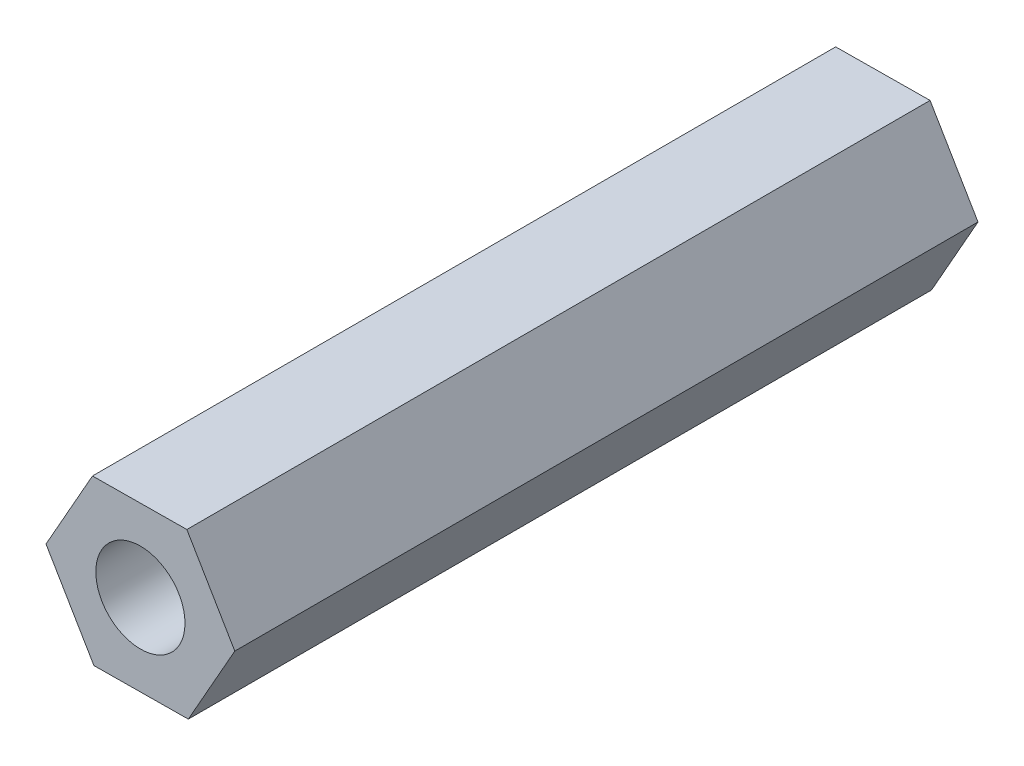
ISO-10303-21;
HEADER;
FILE_DESCRIPTION(('STEP AP214'),'2;1');
FILE_NAME('part.step','',(''),(''),'','','');
FILE_SCHEMA(('AUTOMOTIVE_DESIGN { 1 0 10303 214 1 1 1 1 }'));
ENDSEC;
DATA;
#1=APPLICATION_CONTEXT('core data for automotive mechanical design processes');
#2=APPLICATION_PROTOCOL_DEFINITION('international standard','automotive_design',2000,#1);
#3=PRODUCT_CONTEXT('',#1,'mechanical');
#4=PRODUCT('Part','Part','',(#3));
#5=PRODUCT_RELATED_PRODUCT_CATEGORY('part','',(#4));
#6=PRODUCT_DEFINITION_FORMATION('','',#4);
#7=PRODUCT_DEFINITION_CONTEXT('part definition',#1,'design');
#8=PRODUCT_DEFINITION('design','',#6,#7);
#9=PRODUCT_DEFINITION_SHAPE('','',#8);
#10=(LENGTH_UNIT() NAMED_UNIT(*) SI_UNIT(.MILLI.,.METRE.));
#11=(NAMED_UNIT(*) PLANE_ANGLE_UNIT() SI_UNIT($,.RADIAN.));
#12=(NAMED_UNIT(*) SI_UNIT($,.STERADIAN.) SOLID_ANGLE_UNIT());
#13=UNCERTAINTY_MEASURE_WITH_UNIT(LENGTH_MEASURE(1.E-05),#10,'distance_accuracy_value','');
#14=(GEOMETRIC_REPRESENTATION_CONTEXT(3) GLOBAL_UNCERTAINTY_ASSIGNED_CONTEXT((#13)) GLOBAL_UNIT_ASSIGNED_CONTEXT((#10,
#11,#12)) REPRESENTATION_CONTEXT('',''));
#15=CARTESIAN_POINT('',(0.,0.,0.));
#16=DIRECTION('',(0.,0.,1.));
#17=DIRECTION('',(1.,0.,0.));
#18=AXIS2_PLACEMENT_3D('',#15,#16,#17);
#19=CARTESIAN_POINT('',(0.,0.,25.));
#20=DIRECTION('',(0.,0.,1.));
#21=DIRECTION('',(1.,0.,0.));
#22=AXIS2_PLACEMENT_3D('',#19,#20,#21);
#23=PLANE('',#22);
#24=DIRECTION('',(0.999961257640527,0.00880245522430783,0.));
#25=VECTOR('',#24,1.);
#26=CARTESIAN_POINT('',(-1.56344497664753,-2.76386923321798,25.));
#27=LINE('',#26,#25);
#28=CARTESIAN_POINT('',(-1.56344497664753,-2.76386923321798,25.));
#29=VERTEX_POINT('',#28);
#30=CARTESIAN_POINT('',(1.61185848038122,-2.73591768380492,25.));
#31=VERTEX_POINT('',#30);
#32=EDGE_CURVE('E131',#29,#31,#27,.T.);
#33=ORIENTED_EDGE('',*,*,#32,.T.);
#34=DIRECTION('',(0.492357478980338,0.870393079529086,0.));
#35=VECTOR('',#34,1.);
#36=CARTESIAN_POINT('',(1.61185848038122,-2.73591768380492,25.));
#37=LINE('',#36,#35);
#38=CARTESIAN_POINT('',(3.17530345702875,0.0279515494130611,25.));
#39=VERTEX_POINT('',#38);
#40=EDGE_CURVE('E89',#31,#39,#37,.T.);
#41=ORIENTED_EDGE('',*,*,#40,.T.);
#42=DIRECTION('',(-0.507603778660189,0.861590624304778,0.));
#43=VECTOR('',#42,1.);
#44=CARTESIAN_POINT('',(3.17530345702875,0.0279515494130611,25.));
#45=LINE('',#44,#43);
#46=CARTESIAN_POINT('',(1.56344497664753,2.76386923321798,25.));
#47=VERTEX_POINT('',#46);
#48=EDGE_CURVE('E102',#39,#47,#45,.T.);
#49=ORIENTED_EDGE('',*,*,#48,.T.);
#50=DIRECTION('',(-0.999961257640527,-0.00880245522430783,0.));
#51=VECTOR('',#50,1.);
#52=CARTESIAN_POINT('',(1.56344497664753,2.76386923321798,25.));
#53=LINE('',#52,#51);
#54=CARTESIAN_POINT('',(-1.61185848038122,2.73591768380492,25.));
#55=VERTEX_POINT('',#54);
#56=EDGE_CURVE('E96',#47,#55,#53,.T.);
#57=ORIENTED_EDGE('',*,*,#56,.T.);
#58=DIRECTION('',(-0.492357478980338,-0.870393079529086,0.));
#59=VECTOR('',#58,1.);
#60=CARTESIAN_POINT('',(-1.61185848038122,2.73591768380492,25.));
#61=LINE('',#60,#59);
#62=CARTESIAN_POINT('',(-3.17530345702875,-0.02795154941306,25.));
#63=VERTEX_POINT('',#62);
#64=EDGE_CURVE('E100',#55,#63,#61,.T.);
#65=ORIENTED_EDGE('',*,*,#64,.T.);
#66=DIRECTION('',(0.507603778660189,-0.861590624304779,0.));
#67=VECTOR('',#66,1.);
#68=CARTESIAN_POINT('',(-3.17530345702875,-0.02795154941306,25.));
#69=LINE('',#68,#67);
#70=EDGE_CURVE('E52',#63,#29,#69,.T.);
#71=ORIENTED_EDGE('',*,*,#70,.T.);
#72=EDGE_LOOP('',(#33,#41,#49,#57,#65,#71));
#73=FACE_BOUND('',#72,.T.);
#74=CARTESIAN_POINT('',(0.,0.,25.));
#75=DIRECTION('',(0.,0.,1.));
#76=DIRECTION('',(1.,0.,0.));
#77=AXIS2_PLACEMENT_3D('',#74,#75,#76);
#78=CIRCLE('',#77,1.5);
#79=CARTESIAN_POINT('',(1.5,0.,25.));
#80=VERTEX_POINT('',#79);
#81=EDGE_CURVE('E124',#80,#80,#78,.T.);
#82=ORIENTED_EDGE('',*,*,#81,.F.);
#83=EDGE_LOOP('',(#82));
#84=FACE_BOUND('',#83,.T.);
#85=ADVANCED_FACE('F35',(#73,#84),#23,.T.);
#86=CARTESIAN_POINT('',(0.,0.,0.));
#87=DIRECTION('',(0.,0.,1.));
#88=DIRECTION('',(1.,0.,0.));
#89=AXIS2_PLACEMENT_3D('',#86,#87,#88);
#90=PLANE('',#89);
#91=DIRECTION('',(0.999961257640527,0.00880245522430783,0.));
#92=VECTOR('',#91,1.);
#93=CARTESIAN_POINT('',(-1.56344497664753,-2.76386923321798,0.));
#94=LINE('',#93,#92);
#95=CARTESIAN_POINT('',(-1.56344497664753,-2.76386923321798,0.));
#96=VERTEX_POINT('',#95);
#97=CARTESIAN_POINT('',(1.61185848038122,-2.73591768380492,0.));
#98=VERTEX_POINT('',#97);
#99=EDGE_CURVE('E120',#96,#98,#94,.T.);
#100=ORIENTED_EDGE('',*,*,#99,.F.);
#101=DIRECTION('',(0.507603778660189,-0.861590624304779,0.));
#102=VECTOR('',#101,1.);
#103=CARTESIAN_POINT('',(-3.17530345702875,-0.02795154941306,0.));
#104=LINE('',#103,#102);
#105=CARTESIAN_POINT('',(-3.17530345702875,-0.02795154941306,0.));
#106=VERTEX_POINT('',#105);
#107=EDGE_CURVE('E81',#106,#96,#104,.T.);
#108=ORIENTED_EDGE('',*,*,#107,.F.);
#109=DIRECTION('',(-0.492357478980338,-0.870393079529086,0.));
#110=VECTOR('',#109,1.);
#111=CARTESIAN_POINT('',(-1.61185848038122,2.73591768380492,0.));
#112=LINE('',#111,#110);
#113=CARTESIAN_POINT('',(-1.61185848038122,2.73591768380492,0.));
#114=VERTEX_POINT('',#113);
#115=EDGE_CURVE('E75',#114,#106,#112,.T.);
#116=ORIENTED_EDGE('',*,*,#115,.F.);
#117=DIRECTION('',(-0.999961257640527,-0.00880245522430783,0.));
#118=VECTOR('',#117,1.);
#119=CARTESIAN_POINT('',(1.56344497664753,2.76386923321798,0.));
#120=LINE('',#119,#118);
#121=CARTESIAN_POINT('',(1.56344497664753,2.76386923321798,0.));
#122=VERTEX_POINT('',#121);
#123=EDGE_CURVE('E110',#122,#114,#120,.T.);
#124=ORIENTED_EDGE('',*,*,#123,.F.);
#125=DIRECTION('',(-0.507603778660189,0.861590624304778,0.));
#126=VECTOR('',#125,1.);
#127=CARTESIAN_POINT('',(3.17530345702875,0.0279515494130611,0.));
#128=LINE('',#127,#126);
#129=CARTESIAN_POINT('',(3.17530345702875,0.0279515494130611,0.));
#130=VERTEX_POINT('',#129);
#131=EDGE_CURVE('E126',#130,#122,#128,.T.);
#132=ORIENTED_EDGE('',*,*,#131,.F.);
#133=DIRECTION('',(0.492357478980338,0.870393079529086,0.));
#134=VECTOR('',#133,1.);
#135=CARTESIAN_POINT('',(1.61185848038122,-2.73591768380492,0.));
#136=LINE('',#135,#134);
#137=EDGE_CURVE('E123',#98,#130,#136,.T.);
#138=ORIENTED_EDGE('',*,*,#137,.F.);
#139=EDGE_LOOP('',(#100,#108,#116,#124,#132,#138));
#140=FACE_BOUND('',#139,.T.);
#141=CARTESIAN_POINT('',(0.,0.,0.));
#142=DIRECTION('',(0.,0.,1.));
#143=DIRECTION('',(1.,0.,0.));
#144=AXIS2_PLACEMENT_3D('',#141,#142,#143);
#145=CIRCLE('',#144,1.5);
#146=CARTESIAN_POINT('',(1.5,0.,0.));
#147=VERTEX_POINT('',#146);
#148=EDGE_CURVE('E224',#147,#147,#145,.T.);
#149=ORIENTED_EDGE('',*,*,#148,.T.);
#150=EDGE_LOOP('',(#149));
#151=FACE_BOUND('',#150,.T.);
#152=ADVANCED_FACE('F140',(#140,#151),#90,.F.);
#153=CARTESIAN_POINT('',(-1.56344497664753,-2.76386923321798,25.));
#154=DIRECTION('',(-0.00880245522430783,0.999961257640527,0.));
#155=DIRECTION('',(-0.999961257640527,-0.00880245522430783,0.));
#156=AXIS2_PLACEMENT_3D('',#153,#154,#155);
#157=PLANE('',#156);
#158=ORIENTED_EDGE('',*,*,#99,.T.);
#159=DIRECTION('',(0.,0.,-1.));
#160=VECTOR('',#159,1.);
#161=CARTESIAN_POINT('',(1.61185848038122,-2.73591768380492,25.));
#162=LINE('',#161,#160);
#163=EDGE_CURVE('E11',#31,#98,#162,.T.);
#164=ORIENTED_EDGE('',*,*,#163,.F.);
#165=ORIENTED_EDGE('',*,*,#32,.F.);
#166=DIRECTION('',(0.,0.,-1.));
#167=VECTOR('',#166,1.);
#168=CARTESIAN_POINT('',(-1.56344497664753,-2.76386923321798,25.));
#169=LINE('',#168,#167);
#170=EDGE_CURVE('E116',#29,#96,#169,.T.);
#171=ORIENTED_EDGE('',*,*,#170,.T.);
#172=EDGE_LOOP('',(#158,#164,#165,#171));
#173=FACE_BOUND('',#172,.T.);
#174=ADVANCED_FACE('F37',(#173),#157,.F.);
#175=CARTESIAN_POINT('',(1.61185848038122,-2.73591768380492,25.));
#176=DIRECTION('',(-0.870393079529086,0.492357478980338,0.));
#177=DIRECTION('',(-0.492357478980338,-0.870393079529086,0.));
#178=AXIS2_PLACEMENT_3D('',#175,#176,#177);
#179=PLANE('',#178);
#180=ORIENTED_EDGE('',*,*,#137,.T.);
#181=DIRECTION('',(0.,0.,-1.));
#182=VECTOR('',#181,1.);
#183=CARTESIAN_POINT('',(3.17530345702875,0.0279515494130611,25.));
#184=LINE('',#183,#182);
#185=EDGE_CURVE('E44',#39,#130,#184,.T.);
#186=ORIENTED_EDGE('',*,*,#185,.F.);
#187=ORIENTED_EDGE('',*,*,#40,.F.);
#188=ORIENTED_EDGE('',*,*,#163,.T.);
#189=EDGE_LOOP('',(#180,#186,#187,#188));
#190=FACE_BOUND('',#189,.T.);
#191=ADVANCED_FACE('F165',(#190),#179,.F.);
#192=CARTESIAN_POINT('',(3.17530345702875,0.0279515494130611,25.));
#193=DIRECTION('',(-0.861590624304778,-0.507603778660189,0.));
#194=DIRECTION('',(0.507603778660189,-0.861590624304778,0.));
#195=AXIS2_PLACEMENT_3D('',#192,#193,#194);
#196=PLANE('',#195);
#197=ORIENTED_EDGE('',*,*,#131,.T.);
#198=DIRECTION('',(0.,0.,-1.));
#199=VECTOR('',#198,1.);
#200=CARTESIAN_POINT('',(1.56344497664753,2.76386923321798,25.));
#201=LINE('',#200,#199);
#202=EDGE_CURVE('E111',#47,#122,#201,.T.);
#203=ORIENTED_EDGE('',*,*,#202,.F.);
#204=ORIENTED_EDGE('',*,*,#48,.F.);
#205=ORIENTED_EDGE('',*,*,#185,.T.);
#206=EDGE_LOOP('',(#197,#203,#204,#205));
#207=FACE_BOUND('',#206,.T.);
#208=ADVANCED_FACE('F137',(#207),#196,.F.);
#209=CARTESIAN_POINT('',(1.56344497664753,2.76386923321798,25.));
#210=DIRECTION('',(0.00880245522430783,-0.999961257640527,0.));
#211=DIRECTION('',(0.999961257640527,0.00880245522430783,0.));
#212=AXIS2_PLACEMENT_3D('',#209,#210,#211);
#213=PLANE('',#212);
#214=ORIENTED_EDGE('',*,*,#123,.T.);
#215=DIRECTION('',(0.,0.,-1.));
#216=VECTOR('',#215,1.);
#217=CARTESIAN_POINT('',(-1.61185848038122,2.73591768380492,25.));
#218=LINE('',#217,#216);
#219=EDGE_CURVE('E107',#55,#114,#218,.T.);
#220=ORIENTED_EDGE('',*,*,#219,.F.);
#221=ORIENTED_EDGE('',*,*,#56,.F.);
#222=ORIENTED_EDGE('',*,*,#202,.T.);
#223=EDGE_LOOP('',(#214,#220,#221,#222));
#224=FACE_BOUND('',#223,.T.);
#225=ADVANCED_FACE('F108',(#224),#213,.F.);
#226=CARTESIAN_POINT('',(-1.61185848038122,2.73591768380492,25.));
#227=DIRECTION('',(0.870393079529086,-0.492357478980338,0.));
#228=DIRECTION('',(0.492357478980338,0.870393079529086,0.));
#229=AXIS2_PLACEMENT_3D('',#226,#227,#228);
#230=PLANE('',#229);
#231=ORIENTED_EDGE('',*,*,#115,.T.);
#232=DIRECTION('',(0.,0.,-1.));
#233=VECTOR('',#232,1.);
#234=CARTESIAN_POINT('',(-3.17530345702875,-0.02795154941306,25.));
#235=LINE('',#234,#233);
#236=EDGE_CURVE('E112',#63,#106,#235,.T.);
#237=ORIENTED_EDGE('',*,*,#236,.F.);
#238=ORIENTED_EDGE('',*,*,#64,.F.);
#239=ORIENTED_EDGE('',*,*,#219,.T.);
#240=EDGE_LOOP('',(#231,#237,#238,#239));
#241=FACE_BOUND('',#240,.T.);
#242=ADVANCED_FACE('F114',(#241),#230,.F.);
#243=CARTESIAN_POINT('',(-3.17530345702875,-0.02795154941306,25.));
#244=DIRECTION('',(0.861590624304778,0.507603778660189,0.));
#245=DIRECTION('',(-0.507603778660189,0.861590624304779,0.));
#246=AXIS2_PLACEMENT_3D('',#243,#244,#245);
#247=PLANE('',#246);
#248=ORIENTED_EDGE('',*,*,#107,.T.);
#249=ORIENTED_EDGE('',*,*,#170,.F.);
#250=ORIENTED_EDGE('',*,*,#70,.F.);
#251=ORIENTED_EDGE('',*,*,#236,.T.);
#252=EDGE_LOOP('',(#248,#249,#250,#251));
#253=FACE_BOUND('',#252,.T.);
#254=ADVANCED_FACE('F145',(#253),#247,.F.);
#255=CARTESIAN_POINT('',(0.,0.,25.));
#256=DIRECTION('',(0.,0.,-1.));
#257=DIRECTION('',(-1.,0.,0.));
#258=AXIS2_PLACEMENT_3D('',#255,#256,#257);
#259=CYLINDRICAL_SURFACE('',#258,1.5);
#260=ORIENTED_EDGE('',*,*,#81,.T.);
#261=EDGE_LOOP('',(#260));
#262=FACE_BOUND('',#261,.T.);
#263=ORIENTED_EDGE('',*,*,#148,.F.);
#264=EDGE_LOOP('',(#263));
#265=FACE_BOUND('',#264,.T.);
#266=ADVANCED_FACE('F147',(#262,#265),#259,.F.);
#267=CLOSED_SHELL('',(#85,#152,#174,#191,#208,#225,#242,#254,#266));
#268=MANIFOLD_SOLID_BREP('B2',#267);
#269=ADVANCED_BREP_SHAPE_REPRESENTATION('',(#18,#268),#14);
#270=SHAPE_DEFINITION_REPRESENTATION(#9,#269);
ENDSEC;
END-ISO-10303-21;
